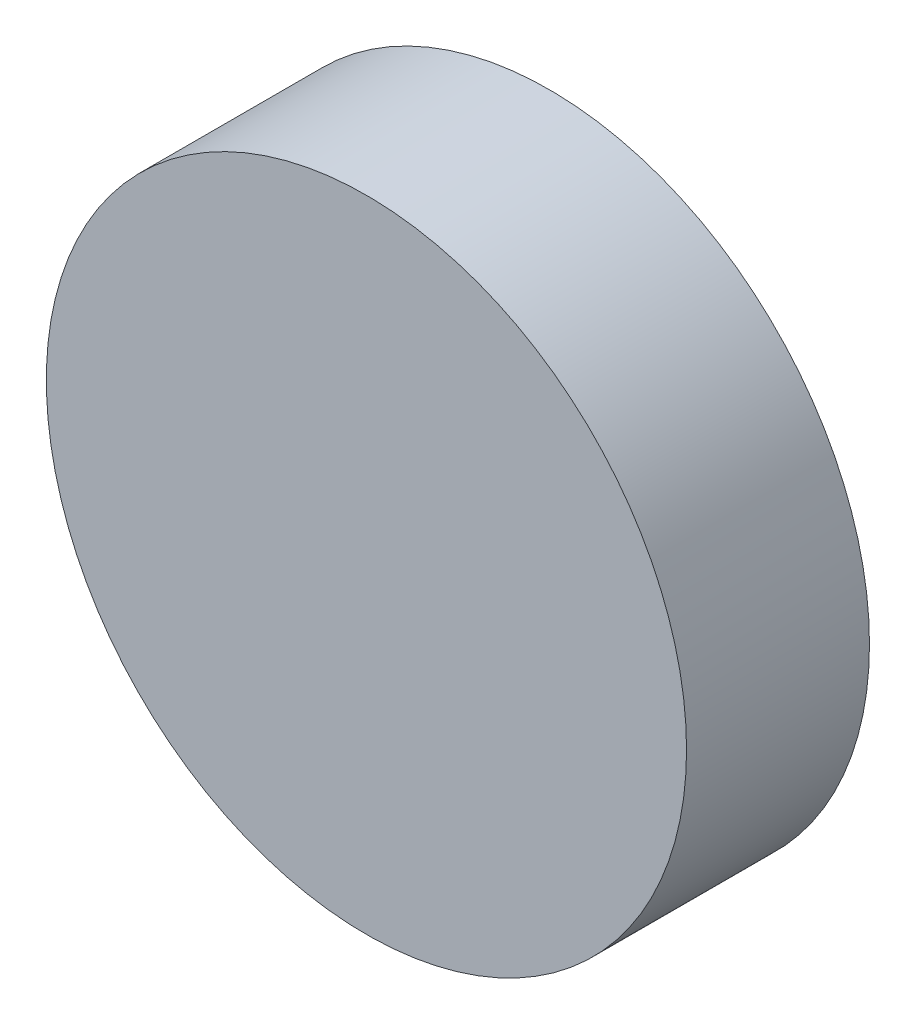
ISO-10303-21;
HEADER;
FILE_DESCRIPTION(('STEP AP214'),'2;1');
FILE_NAME('part.step','',(''),(''),'','','');
FILE_SCHEMA(('AUTOMOTIVE_DESIGN { 1 0 10303 214 1 1 1 1 }'));
ENDSEC;
DATA;
#1=APPLICATION_CONTEXT('core data for automotive mechanical design processes');
#2=APPLICATION_PROTOCOL_DEFINITION('international standard','automotive_design',2000,#1);
#3=PRODUCT_CONTEXT('',#1,'mechanical');
#4=PRODUCT('Part','Part','',(#3));
#5=PRODUCT_RELATED_PRODUCT_CATEGORY('part','',(#4));
#6=PRODUCT_DEFINITION_FORMATION('','',#4);
#7=PRODUCT_DEFINITION_CONTEXT('part definition',#1,'design');
#8=PRODUCT_DEFINITION('design','',#6,#7);
#9=PRODUCT_DEFINITION_SHAPE('','',#8);
#10=(LENGTH_UNIT() NAMED_UNIT(*) SI_UNIT(.MILLI.,.METRE.));
#11=(NAMED_UNIT(*) PLANE_ANGLE_UNIT() SI_UNIT($,.RADIAN.));
#12=(NAMED_UNIT(*) SI_UNIT($,.STERADIAN.) SOLID_ANGLE_UNIT());
#13=UNCERTAINTY_MEASURE_WITH_UNIT(LENGTH_MEASURE(1.E-05),#10,'distance_accuracy_value','');
#14=(GEOMETRIC_REPRESENTATION_CONTEXT(3) GLOBAL_UNCERTAINTY_ASSIGNED_CONTEXT((#13)) GLOBAL_UNIT_ASSIGNED_CONTEXT((#10,
#11,#12)) REPRESENTATION_CONTEXT('',''));
#15=CARTESIAN_POINT('',(0.,0.,0.));
#16=DIRECTION('',(0.,0.,1.));
#17=DIRECTION('',(1.,0.,0.));
#18=AXIS2_PLACEMENT_3D('',#15,#16,#17);
#19=CARTESIAN_POINT('',(450.,105.,-240.));
#20=DIRECTION('',(0.,0.,1.));
#21=DIRECTION('',(1.,0.,0.));
#22=AXIS2_PLACEMENT_3D('',#19,#20,#21);
#23=CYLINDRICAL_SURFACE('',#22,70.);
#24=CARTESIAN_POINT('',(450.,105.,-240.));
#25=DIRECTION('',(0.,0.,1.));
#26=DIRECTION('',(1.,0.,0.));
#27=AXIS2_PLACEMENT_3D('',#24,#25,#26);
#28=CIRCLE('',#27,70.);
#29=CARTESIAN_POINT('',(520.,105.,-240.));
#30=VERTEX_POINT('',#29);
#31=EDGE_CURVE('E10',#30,#30,#28,.T.);
#32=ORIENTED_EDGE('',*,*,#31,.T.);
#33=EDGE_LOOP('',(#32));
#34=FACE_BOUND('',#33,.T.);
#35=CARTESIAN_POINT('',(450.,105.,-200.));
#36=DIRECTION('',(0.,0.,1.));
#37=DIRECTION('',(1.,0.,0.));
#38=AXIS2_PLACEMENT_3D('',#35,#36,#37);
#39=CIRCLE('',#38,70.);
#40=CARTESIAN_POINT('',(520.,105.,-200.));
#41=VERTEX_POINT('',#40);
#42=EDGE_CURVE('E40',#41,#41,#39,.T.);
#43=ORIENTED_EDGE('',*,*,#42,.F.);
#44=EDGE_LOOP('',(#43));
#45=FACE_BOUND('',#44,.T.);
#46=ADVANCED_FACE('F37',(#34,#45),#23,.T.);
#47=CARTESIAN_POINT('',(450.,105.,-240.));
#48=DIRECTION('',(0.,0.,1.));
#49=DIRECTION('',(1.,0.,0.));
#50=AXIS2_PLACEMENT_3D('',#47,#48,#49);
#51=PLANE('',#50);
#52=ORIENTED_EDGE('',*,*,#31,.F.);
#53=EDGE_LOOP('',(#52));
#54=FACE_BOUND('',#53,.T.);
#55=ADVANCED_FACE('F52',(#54),#51,.F.);
#56=CARTESIAN_POINT('',(450.,105.,-200.));
#57=DIRECTION('',(0.,0.,1.));
#58=DIRECTION('',(1.,0.,0.));
#59=AXIS2_PLACEMENT_3D('',#56,#57,#58);
#60=PLANE('',#59);
#61=ORIENTED_EDGE('',*,*,#42,.T.);
#62=EDGE_LOOP('',(#61));
#63=FACE_BOUND('',#62,.T.);
#64=ADVANCED_FACE('F49',(#63),#60,.T.);
#65=CLOSED_SHELL('',(#46,#55,#64));
#66=MANIFOLD_SOLID_BREP('B2',#65);
#67=ADVANCED_BREP_SHAPE_REPRESENTATION('',(#18,#66),#14);
#68=SHAPE_DEFINITION_REPRESENTATION(#9,#67);
ENDSEC;
END-ISO-10303-21;
